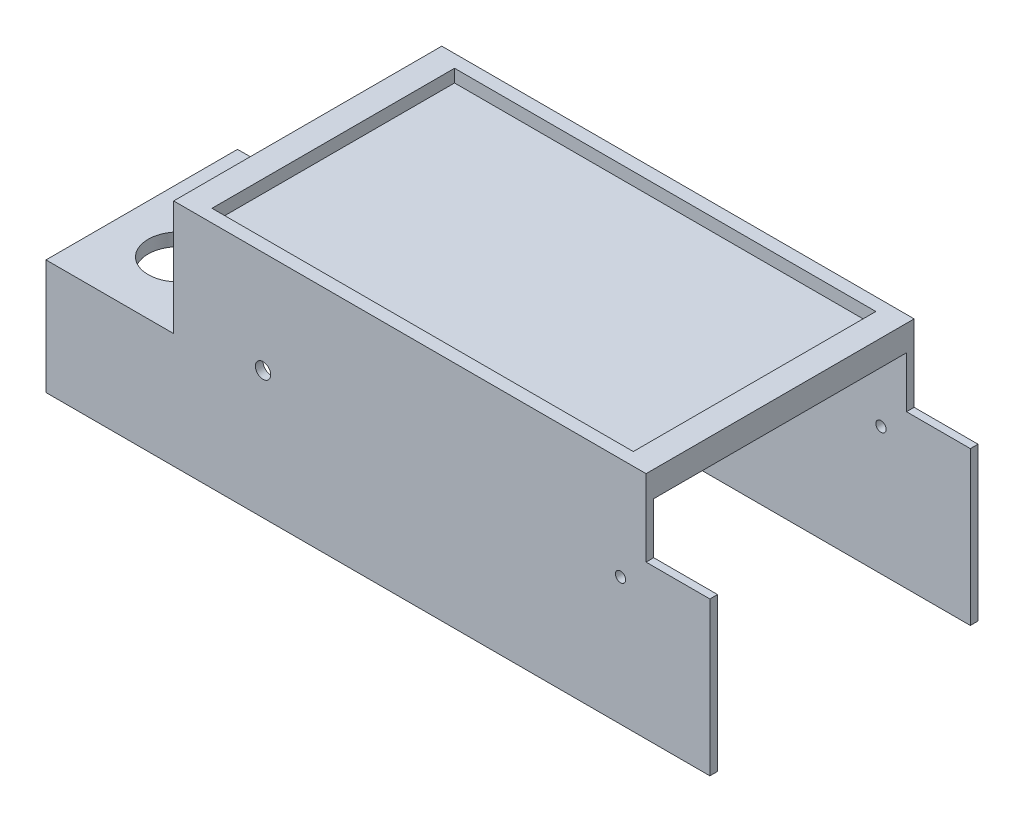
ISO-10303-21;
HEADER;
FILE_DESCRIPTION(('STEP AP214'),'2;1');
FILE_NAME('part.step','',(''),(''),'','','');
FILE_SCHEMA(('AUTOMOTIVE_DESIGN { 1 0 10303 214 1 1 1 1 }'));
ENDSEC;
DATA;
#1=APPLICATION_CONTEXT('core data for automotive mechanical design processes');
#2=APPLICATION_PROTOCOL_DEFINITION('international standard','automotive_design',2000,#1);
#3=PRODUCT_CONTEXT('',#1,'mechanical');
#4=PRODUCT('Part','Part','',(#3));
#5=PRODUCT_RELATED_PRODUCT_CATEGORY('part','',(#4));
#6=PRODUCT_DEFINITION_FORMATION('','',#4);
#7=PRODUCT_DEFINITION_CONTEXT('part definition',#1,'design');
#8=PRODUCT_DEFINITION('design','',#6,#7);
#9=PRODUCT_DEFINITION_SHAPE('','',#8);
#10=(LENGTH_UNIT() NAMED_UNIT(*) SI_UNIT(.MILLI.,.METRE.));
#11=(NAMED_UNIT(*) PLANE_ANGLE_UNIT() SI_UNIT($,.RADIAN.));
#12=(NAMED_UNIT(*) SI_UNIT($,.STERADIAN.) SOLID_ANGLE_UNIT());
#13=UNCERTAINTY_MEASURE_WITH_UNIT(LENGTH_MEASURE(1.E-05),#10,'distance_accuracy_value','');
#14=(GEOMETRIC_REPRESENTATION_CONTEXT(3) GLOBAL_UNCERTAINTY_ASSIGNED_CONTEXT((#13)) GLOBAL_UNIT_ASSIGNED_CONTEXT((#10,
#11,#12)) REPRESENTATION_CONTEXT('',''));
#15=CARTESIAN_POINT('',(0.,0.,0.));
#16=DIRECTION('',(0.,0.,1.));
#17=DIRECTION('',(1.,0.,0.));
#18=AXIS2_PLACEMENT_3D('',#15,#16,#17);
#19=CARTESIAN_POINT('',(105.,90.,-52.5));
#20=DIRECTION('',(-1.,0.,0.));
#21=DIRECTION('',(0.,0.,1.));
#22=AXIS2_PLACEMENT_3D('',#19,#20,#21);
#23=PLANE('',#22);
#24=DIRECTION('',(0.,-1.,0.));
#25=VECTOR('',#24,1.);
#26=CARTESIAN_POINT('',(105.,90.,-52.5));
#27=LINE('',#26,#25);
#28=CARTESIAN_POINT('',(105.,60.,-52.5));
#29=VERTEX_POINT('',#28);
#30=CARTESIAN_POINT('',(105.,0.,-52.5));
#31=VERTEX_POINT('',#30);
#32=EDGE_CURVE('E206',#29,#31,#27,.T.);
#33=ORIENTED_EDGE('',*,*,#32,.F.);
#34=DIRECTION('',(0.,0.,-1.));
#35=VECTOR('',#34,1.);
#36=CARTESIAN_POINT('',(105.,60.,-52.5));
#37=LINE('',#36,#35);
#38=CARTESIAN_POINT('',(105.,60.,-49.5));
#39=VERTEX_POINT('',#38);
#40=EDGE_CURVE('E190',#39,#29,#37,.T.);
#41=ORIENTED_EDGE('',*,*,#40,.F.);
#42=DIRECTION('',(0.,1.,0.));
#43=VECTOR('',#42,1.);
#44=CARTESIAN_POINT('',(105.,0.,-49.5));
#45=LINE('',#44,#43);
#46=CARTESIAN_POINT('',(105.,0.,-49.5));
#47=VERTEX_POINT('',#46);
#48=EDGE_CURVE('E300',#47,#39,#45,.T.);
#49=ORIENTED_EDGE('',*,*,#48,.F.);
#50=DIRECTION('',(0.,0.,-1.));
#51=VECTOR('',#50,1.);
#52=CARTESIAN_POINT('',(105.,0.,-52.5));
#53=LINE('',#52,#51);
#54=EDGE_CURVE('E212',#47,#31,#53,.T.);
#55=ORIENTED_EDGE('',*,*,#54,.T.);
#56=EDGE_LOOP('',(#33,#41,#49,#55));
#57=FACE_BOUND('',#56,.T.);
#58=ADVANCED_FACE('F42',(#57),#23,.F.);
#59=CARTESIAN_POINT('',(0.,0.,0.));
#60=DIRECTION('',(0.,1.,0.));
#61=DIRECTION('',(0.,0.,1.));
#62=AXIS2_PLACEMENT_3D('',#59,#60,#61);
#63=PLANE('',#62);
#64=DIRECTION('',(0.,0.,-1.));
#65=VECTOR('',#64,1.);
#66=CARTESIAN_POINT('',(-95.,0.,49.5));
#67=LINE('',#66,#65);
#68=CARTESIAN_POINT('',(-95.,0.,-19.5));
#69=VERTEX_POINT('',#68);
#70=CARTESIAN_POINT('',(-95.,0.,-49.5));
#71=VERTEX_POINT('',#70);
#72=EDGE_CURVE('E299',#69,#71,#67,.T.);
#73=ORIENTED_EDGE('',*,*,#72,.F.);
#74=DIRECTION('',(-1.,0.,0.));
#75=VECTOR('',#74,1.);
#76=CARTESIAN_POINT('',(105.,0.,-19.5));
#77=LINE('',#76,#75);
#78=CARTESIAN_POINT('',(-155.,0.,-19.5));
#79=VERTEX_POINT('',#78);
#80=EDGE_CURVE('E255',#69,#79,#77,.T.);
#81=ORIENTED_EDGE('',*,*,#80,.T.);
#82=DIRECTION('',(0.,0.,1.));
#83=VECTOR('',#82,1.);
#84=CARTESIAN_POINT('',(-155.,0.,52.5));
#85=LINE('',#84,#83);
#86=CARTESIAN_POINT('',(-155.,0.,-22.5));
#87=VERTEX_POINT('',#86);
#88=EDGE_CURVE('E279',#87,#79,#85,.T.);
#89=ORIENTED_EDGE('',*,*,#88,.F.);
#90=DIRECTION('',(1.,0.,0.));
#91=VECTOR('',#90,1.);
#92=CARTESIAN_POINT('',(-155.,0.,-22.5));
#93=LINE('',#92,#91);
#94=CARTESIAN_POINT('',(-105.,0.,-22.5));
#95=VERTEX_POINT('',#94);
#96=EDGE_CURVE('E282',#87,#95,#93,.T.);
#97=ORIENTED_EDGE('',*,*,#96,.T.);
#98=DIRECTION('',(0.,0.,1.));
#99=VECTOR('',#98,1.);
#100=CARTESIAN_POINT('',(-105.,0.,-52.5));
#101=LINE('',#100,#99);
#102=CARTESIAN_POINT('',(-105.,0.,-52.5));
#103=VERTEX_POINT('',#102);
#104=EDGE_CURVE('E365',#103,#95,#101,.T.);
#105=ORIENTED_EDGE('',*,*,#104,.F.);
#106=DIRECTION('',(-1.,0.,0.));
#107=VECTOR('',#106,1.);
#108=CARTESIAN_POINT('',(-105.,0.,-52.5));
#109=LINE('',#108,#107);
#110=EDGE_CURVE('E363',#31,#103,#109,.T.);
#111=ORIENTED_EDGE('',*,*,#110,.F.);
#112=ORIENTED_EDGE('',*,*,#54,.F.);
#113=DIRECTION('',(1.,0.,0.));
#114=VECTOR('',#113,1.);
#115=CARTESIAN_POINT('',(-95.,0.,-49.5));
#116=LINE('',#115,#114);
#117=EDGE_CURVE('E317',#71,#47,#116,.T.);
#118=ORIENTED_EDGE('',*,*,#117,.F.);
#119=EDGE_LOOP('',(#73,#81,#89,#97,#105,#111,#112,#118));
#120=FACE_BOUND('',#119,.T.);
#121=ADVANCED_FACE('F445',(#120),#63,.F.);
#122=CARTESIAN_POINT('',(-105.,90.,-52.5));
#123=DIRECTION('',(1.,0.,0.));
#124=DIRECTION('',(0.,0.,-1.));
#125=AXIS2_PLACEMENT_3D('',#122,#123,#124);
#126=PLANE('',#125);
#127=DIRECTION('',(0.,-1.,0.));
#128=VECTOR('',#127,1.);
#129=CARTESIAN_POINT('',(-105.,0.,-22.5));
#130=LINE('',#129,#128);
#131=CARTESIAN_POINT('',(-105.,45.,-22.5));
#132=VERTEX_POINT('',#131);
#133=EDGE_CURVE('E273',#132,#95,#130,.T.);
#134=ORIENTED_EDGE('',*,*,#133,.F.);
#135=DIRECTION('',(0.,0.,-1.));
#136=VECTOR('',#135,1.);
#137=CARTESIAN_POINT('',(-105.,45.,52.5));
#138=LINE('',#137,#136);
#139=CARTESIAN_POINT('',(-105.,45.,52.5));
#140=VERTEX_POINT('',#139);
#141=EDGE_CURVE('E268',#140,#132,#138,.T.);
#142=ORIENTED_EDGE('',*,*,#141,.F.);
#143=DIRECTION('',(0.,-1.,0.));
#144=VECTOR('',#143,1.);
#145=CARTESIAN_POINT('',(-105.,90.,52.5));
#146=LINE('',#145,#144);
#147=CARTESIAN_POINT('',(-105.,90.,52.5));
#148=VERTEX_POINT('',#147);
#149=EDGE_CURVE('E217',#148,#140,#146,.T.);
#150=ORIENTED_EDGE('',*,*,#149,.F.);
#151=DIRECTION('',(0.,0.,1.));
#152=VECTOR('',#151,1.);
#153=CARTESIAN_POINT('',(-105.,90.,-52.5));
#154=LINE('',#153,#152);
#155=CARTESIAN_POINT('',(-105.,90.,-52.5));
#156=VERTEX_POINT('',#155);
#157=EDGE_CURVE('E353',#156,#148,#154,.T.);
#158=ORIENTED_EDGE('',*,*,#157,.F.);
#159=DIRECTION('',(0.,-1.,0.));
#160=VECTOR('',#159,1.);
#161=CARTESIAN_POINT('',(-105.,90.,-52.5));
#162=LINE('',#161,#160);
#163=EDGE_CURVE('E214',#156,#103,#162,.T.);
#164=ORIENTED_EDGE('',*,*,#163,.T.);
#165=ORIENTED_EDGE('',*,*,#104,.T.);
#166=EDGE_LOOP('',(#134,#142,#150,#158,#164,#165));
#167=FACE_BOUND('',#166,.T.);
#168=ADVANCED_FACE('F449',(#167),#126,.F.);
#169=DIRECTION('',(0.,-1.,0.));
#170=VECTOR('',#169,1.);
#171=CARTESIAN_POINT('',(105.,0.,49.5));
#172=LINE('',#171,#170);
#173=CARTESIAN_POINT('',(105.,60.,49.5));
#174=VERTEX_POINT('',#173);
#175=CARTESIAN_POINT('',(105.,0.,49.5));
#176=VERTEX_POINT('',#175);
#177=EDGE_CURVE('E295',#174,#176,#172,.T.);
#178=ORIENTED_EDGE('',*,*,#177,.F.);
#179=CARTESIAN_POINT('',(105.,60.,52.5));
#180=VERTEX_POINT('',#179);
#181=EDGE_CURVE('E200',#180,#174,#37,.T.);
#182=ORIENTED_EDGE('',*,*,#181,.F.);
#183=DIRECTION('',(0.,-1.,0.));
#184=VECTOR('',#183,1.);
#185=CARTESIAN_POINT('',(105.,90.,52.5));
#186=LINE('',#185,#184);
#187=CARTESIAN_POINT('',(105.,0.,52.5));
#188=VERTEX_POINT('',#187);
#189=EDGE_CURVE('E359',#180,#188,#186,.T.);
#190=ORIENTED_EDGE('',*,*,#189,.T.);
#191=EDGE_CURVE('E360',#188,#176,#53,.T.);
#192=ORIENTED_EDGE('',*,*,#191,.T.);
#193=EDGE_LOOP('',(#178,#182,#190,#192));
#194=FACE_BOUND('',#193,.T.);
#195=ADVANCED_FACE('F44',(#194),#23,.F.);
#196=CARTESIAN_POINT('',(-105.,90.,-52.5));
#197=DIRECTION('',(0.,0.,1.));
#198=DIRECTION('',(1.,0.,0.));
#199=AXIS2_PLACEMENT_3D('',#196,#197,#198);
#200=PLANE('',#199);
#201=CARTESIAN_POINT('',(-70.,50.,-52.5));
#202=DIRECTION('',(0.,0.,1.));
#203=DIRECTION('',(1.,0.,0.));
#204=AXIS2_PLACEMENT_3D('',#201,#202,#203);
#205=CIRCLE('',#204,3.00000000000001);
#206=CARTESIAN_POINT('',(-67.,50.,-52.5));
#207=VERTEX_POINT('',#206);
#208=EDGE_CURVE('E230',#207,#207,#205,.T.);
#209=ORIENTED_EDGE('',*,*,#208,.T.);
#210=EDGE_LOOP('',(#209));
#211=FACE_BOUND('',#210,.T.);
#212=CARTESIAN_POINT('',(70.,50.,-52.5));
#213=DIRECTION('',(0.,0.,1.));
#214=DIRECTION('',(1.,0.,0.));
#215=AXIS2_PLACEMENT_3D('',#212,#213,#214);
#216=CIRCLE('',#215,2.);
#217=CARTESIAN_POINT('',(72.,50.,-52.5));
#218=VERTEX_POINT('',#217);
#219=EDGE_CURVE('E419',#218,#218,#216,.T.);
#220=ORIENTED_EDGE('',*,*,#219,.T.);
#221=EDGE_LOOP('',(#220));
#222=FACE_BOUND('',#221,.T.);
#223=DIRECTION('',(-1.,0.,0.));
#224=VECTOR('',#223,1.);
#225=CARTESIAN_POINT('',(-105.,90.,-52.5));
#226=LINE('',#225,#224);
#227=CARTESIAN_POINT('',(80.,90.,-52.5));
#228=VERTEX_POINT('',#227);
#229=EDGE_CURVE('E351',#228,#156,#226,.T.);
#230=ORIENTED_EDGE('',*,*,#229,.F.);
#231=DIRECTION('',(0.,1.,0.));
#232=VECTOR('',#231,1.);
#233=CARTESIAN_POINT('',(80.,60.,-52.5));
#234=LINE('',#233,#232);
#235=CARTESIAN_POINT('',(80.,60.,-52.5));
#236=VERTEX_POINT('',#235);
#237=EDGE_CURVE('E208',#236,#228,#234,.T.);
#238=ORIENTED_EDGE('',*,*,#237,.F.);
#239=DIRECTION('',(-1.,0.,0.));
#240=VECTOR('',#239,1.);
#241=CARTESIAN_POINT('',(105.,60.,-52.5));
#242=LINE('',#241,#240);
#243=EDGE_CURVE('E193',#29,#236,#242,.T.);
#244=ORIENTED_EDGE('',*,*,#243,.F.);
#245=ORIENTED_EDGE('',*,*,#32,.T.);
#246=ORIENTED_EDGE('',*,*,#110,.T.);
#247=ORIENTED_EDGE('',*,*,#163,.F.);
#248=EDGE_LOOP('',(#230,#238,#244,#245,#246,#247));
#249=FACE_BOUND('',#248,.T.);
#250=ADVANCED_FACE('F205',(#211,#222,#249),#200,.F.);
#251=CARTESIAN_POINT('',(-105.,90.,52.5));
#252=DIRECTION('',(0.,0.,-1.));
#253=DIRECTION('',(-1.,0.,0.));
#254=AXIS2_PLACEMENT_3D('',#251,#252,#253);
#255=PLANE('',#254);
#256=CARTESIAN_POINT('',(-70.,50.,52.5));
#257=DIRECTION('',(0.,0.,1.));
#258=DIRECTION('',(1.,0.,0.));
#259=AXIS2_PLACEMENT_3D('',#256,#257,#258);
#260=CIRCLE('',#259,3.00000000000001);
#261=CARTESIAN_POINT('',(-67.,50.,52.5));
#262=VERTEX_POINT('',#261);
#263=EDGE_CURVE('E416',#262,#262,#260,.T.);
#264=ORIENTED_EDGE('',*,*,#263,.F.);
#265=EDGE_LOOP('',(#264));
#266=FACE_BOUND('',#265,.T.);
#267=CARTESIAN_POINT('',(70.,50.,52.5));
#268=DIRECTION('',(0.,0.,1.));
#269=DIRECTION('',(1.,0.,0.));
#270=AXIS2_PLACEMENT_3D('',#267,#268,#269);
#271=CIRCLE('',#270,2.);
#272=CARTESIAN_POINT('',(72.,50.,52.5));
#273=VERTEX_POINT('',#272);
#274=EDGE_CURVE('E243',#273,#273,#271,.T.);
#275=ORIENTED_EDGE('',*,*,#274,.F.);
#276=EDGE_LOOP('',(#275));
#277=FACE_BOUND('',#276,.T.);
#278=DIRECTION('',(1.,0.,0.));
#279=VECTOR('',#278,1.);
#280=CARTESIAN_POINT('',(105.,60.,52.5));
#281=LINE('',#280,#279);
#282=CARTESIAN_POINT('',(80.,60.,52.5));
#283=VERTEX_POINT('',#282);
#284=EDGE_CURVE('E400',#283,#180,#281,.T.);
#285=ORIENTED_EDGE('',*,*,#284,.F.);
#286=DIRECTION('',(0.,1.,0.));
#287=VECTOR('',#286,1.);
#288=CARTESIAN_POINT('',(80.,60.,52.5));
#289=LINE('',#288,#287);
#290=CARTESIAN_POINT('',(80.,90.,52.5));
#291=VERTEX_POINT('',#290);
#292=EDGE_CURVE('E403',#283,#291,#289,.T.);
#293=ORIENTED_EDGE('',*,*,#292,.T.);
#294=DIRECTION('',(1.,0.,0.));
#295=VECTOR('',#294,1.);
#296=CARTESIAN_POINT('',(-105.,90.,52.5));
#297=LINE('',#296,#295);
#298=EDGE_CURVE('E356',#148,#291,#297,.T.);
#299=ORIENTED_EDGE('',*,*,#298,.F.);
#300=ORIENTED_EDGE('',*,*,#149,.T.);
#301=DIRECTION('',(1.,0.,0.));
#302=VECTOR('',#301,1.);
#303=CARTESIAN_POINT('',(-155.,45.,52.5));
#304=LINE('',#303,#302);
#305=CARTESIAN_POINT('',(-155.,45.,52.5));
#306=VERTEX_POINT('',#305);
#307=EDGE_CURVE('E292',#306,#140,#304,.T.);
#308=ORIENTED_EDGE('',*,*,#307,.F.);
#309=DIRECTION('',(0.,1.,0.));
#310=VECTOR('',#309,1.);
#311=CARTESIAN_POINT('',(-155.,0.,52.5));
#312=LINE('',#311,#310);
#313=CARTESIAN_POINT('',(-155.,0.,52.5));
#314=VERTEX_POINT('',#313);
#315=EDGE_CURVE('E269',#314,#306,#312,.T.);
#316=ORIENTED_EDGE('',*,*,#315,.F.);
#317=DIRECTION('',(1.,0.,0.));
#318=VECTOR('',#317,1.);
#319=CARTESIAN_POINT('',(-105.,0.,52.5));
#320=LINE('',#319,#318);
#321=EDGE_CURVE('E354',#314,#188,#320,.T.);
#322=ORIENTED_EDGE('',*,*,#321,.T.);
#323=ORIENTED_EDGE('',*,*,#189,.F.);
#324=EDGE_LOOP('',(#285,#293,#299,#300,#308,#316,#322,#323));
#325=FACE_BOUND('',#324,.T.);
#326=ADVANCED_FACE('F375',(#266,#277,#325),#255,.F.);
#327=CARTESIAN_POINT('',(0.,90.,0.));
#328=DIRECTION('',(0.,1.,0.));
#329=DIRECTION('',(0.,0.,1.));
#330=AXIS2_PLACEMENT_3D('',#327,#328,#329);
#331=PLANE('',#330);
#332=DIRECTION('',(0.,0.,1.));
#333=VECTOR('',#332,1.);
#334=CARTESIAN_POINT('',(80.,90.,-52.5));
#335=LINE('',#334,#333);
#336=EDGE_CURVE('E201',#228,#291,#335,.T.);
#337=ORIENTED_EDGE('',*,*,#336,.F.);
#338=ORIENTED_EDGE('',*,*,#229,.T.);
#339=ORIENTED_EDGE('',*,*,#157,.T.);
#340=ORIENTED_EDGE('',*,*,#298,.T.);
#341=EDGE_LOOP('',(#337,#338,#339,#340));
#342=FACE_BOUND('',#341,.T.);
#343=DIRECTION('',(0.,0.,1.));
#344=VECTOR('',#343,1.);
#345=CARTESIAN_POINT('',(-95.,90.,-47.5));
#346=LINE('',#345,#344);
#347=CARTESIAN_POINT('',(-95.,90.,-47.5));
#348=VERTEX_POINT('',#347);
#349=CARTESIAN_POINT('',(-95.,90.,47.5));
#350=VERTEX_POINT('',#349);
#351=EDGE_CURVE('E313',#348,#350,#346,.T.);
#352=ORIENTED_EDGE('',*,*,#351,.F.);
#353=DIRECTION('',(-1.,0.,0.));
#354=VECTOR('',#353,1.);
#355=CARTESIAN_POINT('',(-95.,90.,-47.5));
#356=LINE('',#355,#354);
#357=CARTESIAN_POINT('',(70.,90.,-47.5));
#358=VERTEX_POINT('',#357);
#359=EDGE_CURVE('E324',#358,#348,#356,.T.);
#360=ORIENTED_EDGE('',*,*,#359,.F.);
#361=DIRECTION('',(0.,0.,-1.));
#362=VECTOR('',#361,1.);
#363=CARTESIAN_POINT('',(70.,90.,-47.5));
#364=LINE('',#363,#362);
#365=CARTESIAN_POINT('',(70.,90.,47.5));
#366=VERTEX_POINT('',#365);
#367=EDGE_CURVE('E338',#366,#358,#364,.T.);
#368=ORIENTED_EDGE('',*,*,#367,.F.);
#369=DIRECTION('',(1.,0.,0.));
#370=VECTOR('',#369,1.);
#371=CARTESIAN_POINT('',(-95.,90.,47.5));
#372=LINE('',#371,#370);
#373=EDGE_CURVE('E335',#350,#366,#372,.T.);
#374=ORIENTED_EDGE('',*,*,#373,.F.);
#375=EDGE_LOOP('',(#352,#360,#368,#374));
#376=FACE_BOUND('',#375,.T.);
#377=ADVANCED_FACE('F431',(#342,#376),#331,.T.);
#378=CARTESIAN_POINT('',(-155.,0.,49.5));
#379=VERTEX_POINT('',#378);
#380=EDGE_CURVE('E278',#379,#314,#85,.T.);
#381=ORIENTED_EDGE('',*,*,#380,.F.);
#382=DIRECTION('',(1.,0.,0.));
#383=VECTOR('',#382,1.);
#384=CARTESIAN_POINT('',(-95.,0.,49.5));
#385=LINE('',#384,#383);
#386=EDGE_CURVE('E65',#379,#176,#385,.T.);
#387=ORIENTED_EDGE('',*,*,#386,.T.);
#388=ORIENTED_EDGE('',*,*,#191,.F.);
#389=ORIENTED_EDGE('',*,*,#321,.F.);
#390=EDGE_LOOP('',(#381,#387,#388,#389));
#391=FACE_BOUND('',#390,.T.);
#392=ADVANCED_FACE('F392',(#391),#63,.F.);
#393=CARTESIAN_POINT('',(-95.,85.,-47.5));
#394=DIRECTION('',(-1.,0.,0.));
#395=DIRECTION('',(0.,0.,1.));
#396=AXIS2_PLACEMENT_3D('',#393,#394,#395);
#397=PLANE('',#396);
#398=ORIENTED_EDGE('',*,*,#351,.T.);
#399=DIRECTION('',(0.,1.,0.));
#400=VECTOR('',#399,1.);
#401=CARTESIAN_POINT('',(-95.,85.,47.5));
#402=LINE('',#401,#400);
#403=CARTESIAN_POINT('',(-95.,85.,47.5));
#404=VERTEX_POINT('',#403);
#405=EDGE_CURVE('E333',#404,#350,#402,.T.);
#406=ORIENTED_EDGE('',*,*,#405,.F.);
#407=DIRECTION('',(0.,0.,1.));
#408=VECTOR('',#407,1.);
#409=CARTESIAN_POINT('',(-95.,85.,-47.5));
#410=LINE('',#409,#408);
#411=CARTESIAN_POINT('',(-95.,85.,-47.5));
#412=VERTEX_POINT('',#411);
#413=EDGE_CURVE('E320',#412,#404,#410,.T.);
#414=ORIENTED_EDGE('',*,*,#413,.F.);
#415=DIRECTION('',(0.,1.,0.));
#416=VECTOR('',#415,1.);
#417=CARTESIAN_POINT('',(-95.,85.,-47.5));
#418=LINE('',#417,#416);
#419=EDGE_CURVE('E343',#412,#348,#418,.T.);
#420=ORIENTED_EDGE('',*,*,#419,.T.);
#421=EDGE_LOOP('',(#398,#406,#414,#420));
#422=FACE_BOUND('',#421,.T.);
#423=ADVANCED_FACE('F493',(#422),#397,.F.);
#424=CARTESIAN_POINT('',(-95.,85.,-47.5));
#425=DIRECTION('',(0.,0.,-1.));
#426=DIRECTION('',(-1.,0.,0.));
#427=AXIS2_PLACEMENT_3D('',#424,#425,#426);
#428=PLANE('',#427);
#429=ORIENTED_EDGE('',*,*,#359,.T.);
#430=ORIENTED_EDGE('',*,*,#419,.F.);
#431=DIRECTION('',(-1.,0.,0.));
#432=VECTOR('',#431,1.);
#433=CARTESIAN_POINT('',(-95.,85.,-47.5));
#434=LINE('',#433,#432);
#435=CARTESIAN_POINT('',(70.,85.,-47.5));
#436=VERTEX_POINT('',#435);
#437=EDGE_CURVE('E330',#436,#412,#434,.T.);
#438=ORIENTED_EDGE('',*,*,#437,.F.);
#439=DIRECTION('',(0.,1.,0.));
#440=VECTOR('',#439,1.);
#441=CARTESIAN_POINT('',(70.,85.,-47.5));
#442=LINE('',#441,#440);
#443=EDGE_CURVE('E345',#436,#358,#442,.T.);
#444=ORIENTED_EDGE('',*,*,#443,.T.);
#445=EDGE_LOOP('',(#429,#430,#438,#444));
#446=FACE_BOUND('',#445,.T.);
#447=ADVANCED_FACE('F489',(#446),#428,.F.);
#448=CARTESIAN_POINT('',(70.,85.,-47.5));
#449=DIRECTION('',(1.,0.,0.));
#450=DIRECTION('',(0.,0.,-1.));
#451=AXIS2_PLACEMENT_3D('',#448,#449,#450);
#452=PLANE('',#451);
#453=ORIENTED_EDGE('',*,*,#367,.T.);
#454=ORIENTED_EDGE('',*,*,#443,.F.);
#455=DIRECTION('',(0.,0.,-1.));
#456=VECTOR('',#455,1.);
#457=CARTESIAN_POINT('',(70.,85.,-47.5));
#458=LINE('',#457,#456);
#459=CARTESIAN_POINT('',(70.,85.,47.5));
#460=VERTEX_POINT('',#459);
#461=EDGE_CURVE('E327',#460,#436,#458,.T.);
#462=ORIENTED_EDGE('',*,*,#461,.F.);
#463=DIRECTION('',(0.,1.,0.));
#464=VECTOR('',#463,1.);
#465=CARTESIAN_POINT('',(70.,85.,47.5));
#466=LINE('',#465,#464);
#467=EDGE_CURVE('E347',#460,#366,#466,.T.);
#468=ORIENTED_EDGE('',*,*,#467,.T.);
#469=EDGE_LOOP('',(#453,#454,#462,#468));
#470=FACE_BOUND('',#469,.T.);
#471=ADVANCED_FACE('F492',(#470),#452,.F.);
#472=CARTESIAN_POINT('',(-95.,85.,47.5));
#473=DIRECTION('',(0.,0.,1.));
#474=DIRECTION('',(1.,0.,0.));
#475=AXIS2_PLACEMENT_3D('',#472,#473,#474);
#476=PLANE('',#475);
#477=ORIENTED_EDGE('',*,*,#373,.T.);
#478=ORIENTED_EDGE('',*,*,#467,.F.);
#479=DIRECTION('',(1.,0.,0.));
#480=VECTOR('',#479,1.);
#481=CARTESIAN_POINT('',(-95.,85.,47.5));
#482=LINE('',#481,#480);
#483=EDGE_CURVE('E323',#404,#460,#482,.T.);
#484=ORIENTED_EDGE('',*,*,#483,.F.);
#485=ORIENTED_EDGE('',*,*,#405,.T.);
#486=EDGE_LOOP('',(#477,#478,#484,#485));
#487=FACE_BOUND('',#486,.T.);
#488=ADVANCED_FACE('F484',(#487),#476,.F.);
#489=CARTESIAN_POINT('',(0.,85.,0.));
#490=DIRECTION('',(0.,1.,0.));
#491=DIRECTION('',(0.,0.,1.));
#492=AXIS2_PLACEMENT_3D('',#489,#490,#491);
#493=PLANE('',#492);
#494=ORIENTED_EDGE('',*,*,#413,.T.);
#495=ORIENTED_EDGE('',*,*,#483,.T.);
#496=ORIENTED_EDGE('',*,*,#461,.T.);
#497=ORIENTED_EDGE('',*,*,#437,.T.);
#498=EDGE_LOOP('',(#494,#495,#496,#497));
#499=FACE_BOUND('',#498,.T.);
#500=ADVANCED_FACE('F474',(#499),#493,.T.);
#501=CARTESIAN_POINT('',(-95.,0.,49.5));
#502=DIRECTION('',(0.,0.,1.));
#503=DIRECTION('',(1.,0.,0.));
#504=AXIS2_PLACEMENT_3D('',#501,#502,#503);
#505=PLANE('',#504);
#506=CARTESIAN_POINT('',(-70.,50.,49.5));
#507=DIRECTION('',(0.,0.,1.));
#508=DIRECTION('',(1.,0.,0.));
#509=AXIS2_PLACEMENT_3D('',#506,#507,#508);
#510=CIRCLE('',#509,3.00000000000001);
#511=CARTESIAN_POINT('',(-67.,50.,49.5));
#512=VERTEX_POINT('',#511);
#513=EDGE_CURVE('E233',#512,#512,#510,.T.);
#514=ORIENTED_EDGE('',*,*,#513,.T.);
#515=EDGE_LOOP('',(#514));
#516=FACE_BOUND('',#515,.T.);
#517=CARTESIAN_POINT('',(70.,50.,49.5));
#518=DIRECTION('',(0.,0.,1.));
#519=DIRECTION('',(1.,0.,0.));
#520=AXIS2_PLACEMENT_3D('',#517,#518,#519);
#521=CIRCLE('',#520,2.);
#522=CARTESIAN_POINT('',(72.,50.,49.5));
#523=VERTEX_POINT('',#522);
#524=EDGE_CURVE('E229',#523,#523,#521,.T.);
#525=ORIENTED_EDGE('',*,*,#524,.T.);
#526=EDGE_LOOP('',(#525));
#527=FACE_BOUND('',#526,.T.);
#528=DIRECTION('',(1.,0.,0.));
#529=VECTOR('',#528,1.);
#530=CARTESIAN_POINT('',(-95.,80.,49.5));
#531=LINE('',#530,#529);
#532=CARTESIAN_POINT('',(-95.,80.,49.5));
#533=VERTEX_POINT('',#532);
#534=CARTESIAN_POINT('',(80.,80.,49.5));
#535=VERTEX_POINT('',#534);
#536=EDGE_CURVE('E310',#533,#535,#531,.T.);
#537=ORIENTED_EDGE('',*,*,#536,.T.);
#538=DIRECTION('',(0.,-1.,0.));
#539=VECTOR('',#538,1.);
#540=CARTESIAN_POINT('',(80.,0.,49.5));
#541=LINE('',#540,#539);
#542=CARTESIAN_POINT('',(80.,60.,49.5));
#543=VERTEX_POINT('',#542);
#544=EDGE_CURVE('E411',#535,#543,#541,.T.);
#545=ORIENTED_EDGE('',*,*,#544,.T.);
#546=DIRECTION('',(1.,0.,0.));
#547=VECTOR('',#546,1.);
#548=CARTESIAN_POINT('',(-95.,60.,49.5));
#549=LINE('',#548,#547);
#550=EDGE_CURVE('E405',#543,#174,#549,.T.);
#551=ORIENTED_EDGE('',*,*,#550,.T.);
#552=ORIENTED_EDGE('',*,*,#177,.T.);
#553=ORIENTED_EDGE('',*,*,#386,.F.);
#554=DIRECTION('',(0.,1.,0.));
#555=VECTOR('',#554,1.);
#556=CARTESIAN_POINT('',(-155.,40.,49.5));
#557=LINE('',#556,#555);
#558=CARTESIAN_POINT('',(-155.,40.,49.5));
#559=VERTEX_POINT('',#558);
#560=EDGE_CURVE('E250',#379,#559,#557,.T.);
#561=ORIENTED_EDGE('',*,*,#560,.T.);
#562=DIRECTION('',(-1.,0.,0.));
#563=VECTOR('',#562,1.);
#564=CARTESIAN_POINT('',(105.,40.,49.5));
#565=LINE('',#564,#563);
#566=CARTESIAN_POINT('',(-95.,40.,49.5));
#567=VERTEX_POINT('',#566);
#568=EDGE_CURVE('E259',#567,#559,#565,.T.);
#569=ORIENTED_EDGE('',*,*,#568,.F.);
#570=DIRECTION('',(0.,-1.,0.));
#571=VECTOR('',#570,1.);
#572=CARTESIAN_POINT('',(-95.,0.,49.5));
#573=LINE('',#572,#571);
#574=EDGE_CURVE('E296',#533,#567,#573,.T.);
#575=ORIENTED_EDGE('',*,*,#574,.F.);
#576=EDGE_LOOP('',(#537,#545,#551,#552,#553,#561,#569,#575));
#577=FACE_BOUND('',#576,.T.);
#578=ADVANCED_FACE('F471',(#516,#527,#577),#505,.F.);
#579=CARTESIAN_POINT('',(-95.,80.,49.5));
#580=DIRECTION('',(0.,1.,0.));
#581=DIRECTION('',(0.,0.,1.));
#582=AXIS2_PLACEMENT_3D('',#579,#580,#581);
#583=PLANE('',#582);
#584=DIRECTION('',(1.,0.,0.));
#585=VECTOR('',#584,1.);
#586=CARTESIAN_POINT('',(-95.,80.,-49.5));
#587=LINE('',#586,#585);
#588=CARTESIAN_POINT('',(-95.,80.,-49.5));
#589=VERTEX_POINT('',#588);
#590=CARTESIAN_POINT('',(80.,80.,-49.5));
#591=VERTEX_POINT('',#590);
#592=EDGE_CURVE('E314',#589,#591,#587,.T.);
#593=ORIENTED_EDGE('',*,*,#592,.T.);
#594=DIRECTION('',(0.,0.,1.));
#595=VECTOR('',#594,1.);
#596=CARTESIAN_POINT('',(80.,80.,49.5));
#597=LINE('',#596,#595);
#598=EDGE_CURVE('E408',#591,#535,#597,.T.);
#599=ORIENTED_EDGE('',*,*,#598,.T.);
#600=ORIENTED_EDGE('',*,*,#536,.F.);
#601=DIRECTION('',(0.,0.,1.));
#602=VECTOR('',#601,1.);
#603=CARTESIAN_POINT('',(-95.,80.,49.5));
#604=LINE('',#603,#602);
#605=EDGE_CURVE('E305',#589,#533,#604,.T.);
#606=ORIENTED_EDGE('',*,*,#605,.F.);
#607=EDGE_LOOP('',(#593,#599,#600,#606));
#608=FACE_BOUND('',#607,.T.);
#609=ADVANCED_FACE('F473',(#608),#583,.F.);
#610=CARTESIAN_POINT('',(-95.,0.,-49.5));
#611=DIRECTION('',(0.,0.,-1.));
#612=DIRECTION('',(-1.,0.,0.));
#613=AXIS2_PLACEMENT_3D('',#610,#611,#612);
#614=PLANE('',#613);
#615=CARTESIAN_POINT('',(-70.,50.,-49.5));
#616=DIRECTION('',(0.,0.,-1.));
#617=DIRECTION('',(-1.,0.,0.));
#618=AXIS2_PLACEMENT_3D('',#615,#616,#617);
#619=CIRCLE('',#618,3.00000000000001);
#620=CARTESIAN_POINT('',(-73.,50.,-49.5));
#621=VERTEX_POINT('',#620);
#622=EDGE_CURVE('E231',#621,#621,#619,.T.);
#623=ORIENTED_EDGE('',*,*,#622,.T.);
#624=EDGE_LOOP('',(#623));
#625=FACE_BOUND('',#624,.T.);
#626=CARTESIAN_POINT('',(70.,50.,-49.5));
#627=DIRECTION('',(0.,0.,-1.));
#628=DIRECTION('',(-1.,0.,0.));
#629=AXIS2_PLACEMENT_3D('',#626,#627,#628);
#630=CIRCLE('',#629,2.);
#631=CARTESIAN_POINT('',(68.,50.,-49.5));
#632=VERTEX_POINT('',#631);
#633=EDGE_CURVE('E226',#632,#632,#630,.T.);
#634=ORIENTED_EDGE('',*,*,#633,.T.);
#635=EDGE_LOOP('',(#634));
#636=FACE_BOUND('',#635,.T.);
#637=DIRECTION('',(-1.,0.,0.));
#638=VECTOR('',#637,1.);
#639=CARTESIAN_POINT('',(-95.,60.,-49.5));
#640=LINE('',#639,#638);
#641=CARTESIAN_POINT('',(80.,60.,-49.5));
#642=VERTEX_POINT('',#641);
#643=EDGE_CURVE('E50',#39,#642,#640,.T.);
#644=ORIENTED_EDGE('',*,*,#643,.T.);
#645=DIRECTION('',(0.,1.,0.));
#646=VECTOR('',#645,1.);
#647=CARTESIAN_POINT('',(80.,0.,-49.5));
#648=LINE('',#647,#646);
#649=EDGE_CURVE('E11',#642,#591,#648,.T.);
#650=ORIENTED_EDGE('',*,*,#649,.T.);
#651=ORIENTED_EDGE('',*,*,#592,.F.);
#652=DIRECTION('',(0.,1.,0.));
#653=VECTOR('',#652,1.);
#654=CARTESIAN_POINT('',(-95.,0.,-49.5));
#655=LINE('',#654,#653);
#656=EDGE_CURVE('E302',#71,#589,#655,.T.);
#657=ORIENTED_EDGE('',*,*,#656,.F.);
#658=ORIENTED_EDGE('',*,*,#117,.T.);
#659=ORIENTED_EDGE('',*,*,#48,.T.);
#660=EDGE_LOOP('',(#644,#650,#651,#657,#658,#659));
#661=FACE_BOUND('',#660,.T.);
#662=ADVANCED_FACE('F481',(#625,#636,#661),#614,.F.);
#663=CARTESIAN_POINT('',(-95.,0.,0.));
#664=DIRECTION('',(-1.,0.,0.));
#665=DIRECTION('',(0.,0.,1.));
#666=AXIS2_PLACEMENT_3D('',#663,#664,#665);
#667=PLANE('',#666);
#668=DIRECTION('',(0.,0.,-1.));
#669=VECTOR('',#668,1.);
#670=CARTESIAN_POINT('',(-95.,40.,0.));
#671=LINE('',#670,#669);
#672=CARTESIAN_POINT('',(-95.,40.,-19.5));
#673=VERTEX_POINT('',#672);
#674=EDGE_CURVE('E258',#567,#673,#671,.T.);
#675=ORIENTED_EDGE('',*,*,#674,.T.);
#676=DIRECTION('',(0.,-1.,0.));
#677=VECTOR('',#676,1.);
#678=CARTESIAN_POINT('',(-95.,0.,-19.5));
#679=LINE('',#678,#677);
#680=EDGE_CURVE('E265',#673,#69,#679,.T.);
#681=ORIENTED_EDGE('',*,*,#680,.T.);
#682=ORIENTED_EDGE('',*,*,#72,.T.);
#683=ORIENTED_EDGE('',*,*,#656,.T.);
#684=ORIENTED_EDGE('',*,*,#605,.T.);
#685=ORIENTED_EDGE('',*,*,#574,.T.);
#686=EDGE_LOOP('',(#675,#681,#682,#683,#684,#685));
#687=FACE_BOUND('',#686,.T.);
#688=ADVANCED_FACE('F536',(#687),#667,.F.);
#689=CARTESIAN_POINT('',(-155.,45.,52.5));
#690=DIRECTION('',(0.,-1.,0.));
#691=DIRECTION('',(0.,0.,-1.));
#692=AXIS2_PLACEMENT_3D('',#689,#690,#691);
#693=PLANE('',#692);
#694=CARTESIAN_POINT('',(-130.,45.,25.5));
#695=DIRECTION('',(0.,1.,0.));
#696=DIRECTION('',(0.,0.,1.));
#697=AXIS2_PLACEMENT_3D('',#694,#695,#696);
#698=CIRCLE('',#697,12.);
#699=CARTESIAN_POINT('',(-130.,45.,37.5));
#700=VERTEX_POINT('',#699);
#701=EDGE_CURVE('E225',#700,#700,#698,.T.);
#702=ORIENTED_EDGE('',*,*,#701,.F.);
#703=EDGE_LOOP('',(#702));
#704=FACE_BOUND('',#703,.T.);
#705=ORIENTED_EDGE('',*,*,#141,.T.);
#706=DIRECTION('',(1.,0.,0.));
#707=VECTOR('',#706,1.);
#708=CARTESIAN_POINT('',(-155.,45.,-22.5));
#709=LINE('',#708,#707);
#710=CARTESIAN_POINT('',(-155.,45.,-22.5));
#711=VERTEX_POINT('',#710);
#712=EDGE_CURVE('E289',#711,#132,#709,.T.);
#713=ORIENTED_EDGE('',*,*,#712,.F.);
#714=DIRECTION('',(0.,0.,-1.));
#715=VECTOR('',#714,1.);
#716=CARTESIAN_POINT('',(-155.,45.,52.5));
#717=LINE('',#716,#715);
#718=EDGE_CURVE('E272',#306,#711,#717,.T.);
#719=ORIENTED_EDGE('',*,*,#718,.F.);
#720=ORIENTED_EDGE('',*,*,#307,.T.);
#721=EDGE_LOOP('',(#705,#713,#719,#720));
#722=FACE_BOUND('',#721,.T.);
#723=ADVANCED_FACE('F381',(#704,#722),#693,.F.);
#724=CARTESIAN_POINT('',(-155.,0.,-22.5));
#725=DIRECTION('',(0.,0.,1.));
#726=DIRECTION('',(1.,0.,0.));
#727=AXIS2_PLACEMENT_3D('',#724,#725,#726);
#728=PLANE('',#727);
#729=ORIENTED_EDGE('',*,*,#133,.T.);
#730=ORIENTED_EDGE('',*,*,#96,.F.);
#731=DIRECTION('',(0.,-1.,0.));
#732=VECTOR('',#731,1.);
#733=CARTESIAN_POINT('',(-155.,0.,-22.5));
#734=LINE('',#733,#732);
#735=EDGE_CURVE('E276',#711,#87,#734,.T.);
#736=ORIENTED_EDGE('',*,*,#735,.F.);
#737=ORIENTED_EDGE('',*,*,#712,.T.);
#738=EDGE_LOOP('',(#729,#730,#736,#737));
#739=FACE_BOUND('',#738,.T.);
#740=ADVANCED_FACE('F460',(#739),#728,.F.);
#741=CARTESIAN_POINT('',(-155.,0.,0.));
#742=DIRECTION('',(-1.,0.,0.));
#743=DIRECTION('',(0.,0.,1.));
#744=AXIS2_PLACEMENT_3D('',#741,#742,#743);
#745=PLANE('',#744);
#746=DIRECTION('',(0.,-1.,0.));
#747=VECTOR('',#746,1.);
#748=CARTESIAN_POINT('',(-155.,40.,-19.5));
#749=LINE('',#748,#747);
#750=CARTESIAN_POINT('',(-155.,40.,-19.5));
#751=VERTEX_POINT('',#750);
#752=EDGE_CURVE('E224',#751,#79,#749,.T.);
#753=ORIENTED_EDGE('',*,*,#752,.F.);
#754=DIRECTION('',(0.,0.,-1.));
#755=VECTOR('',#754,1.);
#756=CARTESIAN_POINT('',(-155.,40.,-19.5));
#757=LINE('',#756,#755);
#758=EDGE_CURVE('E252',#559,#751,#757,.T.);
#759=ORIENTED_EDGE('',*,*,#758,.F.);
#760=ORIENTED_EDGE('',*,*,#560,.F.);
#761=ORIENTED_EDGE('',*,*,#380,.T.);
#762=ORIENTED_EDGE('',*,*,#315,.T.);
#763=ORIENTED_EDGE('',*,*,#718,.T.);
#764=ORIENTED_EDGE('',*,*,#735,.T.);
#765=ORIENTED_EDGE('',*,*,#88,.T.);
#766=EDGE_LOOP('',(#753,#759,#760,#761,#762,#763,#764,#765));
#767=FACE_BOUND('',#766,.T.);
#768=ADVANCED_FACE('F386',(#767),#745,.T.);
#769=CARTESIAN_POINT('',(105.,40.,-19.5));
#770=DIRECTION('',(0.,0.,-1.));
#771=DIRECTION('',(0.,1.,0.));
#772=AXIS2_PLACEMENT_3D('',#769,#770,#771);
#773=PLANE('',#772);
#774=DIRECTION('',(-1.,0.,0.));
#775=VECTOR('',#774,1.);
#776=CARTESIAN_POINT('',(105.,40.,-19.5));
#777=LINE('',#776,#775);
#778=EDGE_CURVE('E256',#673,#751,#777,.T.);
#779=ORIENTED_EDGE('',*,*,#778,.T.);
#780=ORIENTED_EDGE('',*,*,#752,.T.);
#781=ORIENTED_EDGE('',*,*,#80,.F.);
#782=ORIENTED_EDGE('',*,*,#680,.F.);
#783=EDGE_LOOP('',(#779,#780,#781,#782));
#784=FACE_BOUND('',#783,.T.);
#785=ADVANCED_FACE('F465',(#784),#773,.F.);
#786=CARTESIAN_POINT('',(105.,40.,-19.5));
#787=DIRECTION('',(0.,1.,0.));
#788=DIRECTION('',(0.,0.,1.));
#789=AXIS2_PLACEMENT_3D('',#786,#787,#788);
#790=PLANE('',#789);
#791=CARTESIAN_POINT('',(-130.,40.,25.5));
#792=DIRECTION('',(0.,1.,0.));
#793=DIRECTION('',(0.,0.,1.));
#794=AXIS2_PLACEMENT_3D('',#791,#792,#793);
#795=CIRCLE('',#794,12.);
#796=CARTESIAN_POINT('',(-130.,40.,37.5));
#797=VERTEX_POINT('',#796);
#798=EDGE_CURVE('E221',#797,#797,#795,.T.);
#799=ORIENTED_EDGE('',*,*,#798,.T.);
#800=EDGE_LOOP('',(#799));
#801=FACE_BOUND('',#800,.T.);
#802=ORIENTED_EDGE('',*,*,#568,.T.);
#803=ORIENTED_EDGE('',*,*,#758,.T.);
#804=ORIENTED_EDGE('',*,*,#778,.F.);
#805=ORIENTED_EDGE('',*,*,#674,.F.);
#806=EDGE_LOOP('',(#802,#803,#804,#805));
#807=FACE_BOUND('',#806,.T.);
#808=ADVANCED_FACE('F468',(#801,#807),#790,.F.);
#809=CARTESIAN_POINT('',(-130.,0.,25.5));
#810=DIRECTION('',(0.,1.,0.));
#811=DIRECTION('',(0.,0.,1.));
#812=AXIS2_PLACEMENT_3D('',#809,#810,#811);
#813=CYLINDRICAL_SURFACE('',#812,12.);
#814=CARTESIAN_POINT('',(-130.,45.,37.5));
#815=CARTESIAN_POINT('',(-130.,44.9479166666667,37.5));
#816=CARTESIAN_POINT('',(-130.,44.8958333333333,37.5));
#817=CARTESIAN_POINT('',(-130.,44.7916666666667,37.5));
#818=CARTESIAN_POINT('',(-130.,44.7395833333333,37.5));
#819=CARTESIAN_POINT('',(-130.,44.6354166666667,37.5));
#820=CARTESIAN_POINT('',(-130.,44.5833333333333,37.5));
#821=CARTESIAN_POINT('',(-130.,44.4791666666667,37.5));
#822=CARTESIAN_POINT('',(-130.,44.4270833333333,37.5));
#823=CARTESIAN_POINT('',(-130.,44.3229166666667,37.5));
#824=CARTESIAN_POINT('',(-130.,44.2708333333333,37.5));
#825=CARTESIAN_POINT('',(-130.,44.1666666666667,37.5));
#826=CARTESIAN_POINT('',(-130.,44.1145833333333,37.5));
#827=CARTESIAN_POINT('',(-130.,44.0104166666667,37.5));
#828=CARTESIAN_POINT('',(-130.,43.9583333333333,37.5));
#829=CARTESIAN_POINT('',(-130.,43.8541666666667,37.5));
#830=CARTESIAN_POINT('',(-130.,43.8020833333333,37.5));
#831=CARTESIAN_POINT('',(-130.,43.6979166666667,37.5));
#832=CARTESIAN_POINT('',(-130.,43.6458333333333,37.5));
#833=CARTESIAN_POINT('',(-130.,43.5416666666667,37.5));
#834=CARTESIAN_POINT('',(-130.,43.4895833333333,37.5));
#835=CARTESIAN_POINT('',(-130.,43.3854166666667,37.5));
#836=CARTESIAN_POINT('',(-130.,43.3333333333333,37.5));
#837=CARTESIAN_POINT('',(-130.,43.2291666666667,37.5));
#838=CARTESIAN_POINT('',(-130.,43.1770833333333,37.5));
#839=CARTESIAN_POINT('',(-130.,43.0729166666667,37.5));
#840=CARTESIAN_POINT('',(-130.,43.0208333333333,37.5));
#841=CARTESIAN_POINT('',(-130.,42.9166666666667,37.5));
#842=CARTESIAN_POINT('',(-130.,42.8645833333333,37.5));
#843=CARTESIAN_POINT('',(-130.,42.7604166666667,37.5));
#844=CARTESIAN_POINT('',(-130.,42.7083333333333,37.5));
#845=CARTESIAN_POINT('',(-130.,42.6041666666667,37.5));
#846=CARTESIAN_POINT('',(-130.,42.5520833333333,37.5));
#847=CARTESIAN_POINT('',(-130.,42.4479166666667,37.5));
#848=CARTESIAN_POINT('',(-130.,42.3958333333333,37.5));
#849=CARTESIAN_POINT('',(-130.,42.2916666666667,37.5));
#850=CARTESIAN_POINT('',(-130.,42.2395833333333,37.5));
#851=CARTESIAN_POINT('',(-130.,42.1354166666667,37.5));
#852=CARTESIAN_POINT('',(-130.,42.0833333333333,37.5));
#853=CARTESIAN_POINT('',(-130.,41.9791666666667,37.5));
#854=CARTESIAN_POINT('',(-130.,41.9270833333333,37.5));
#855=CARTESIAN_POINT('',(-130.,41.8229166666667,37.5));
#856=CARTESIAN_POINT('',(-130.,41.7708333333333,37.5));
#857=CARTESIAN_POINT('',(-130.,41.6666666666667,37.5));
#858=CARTESIAN_POINT('',(-130.,41.6145833333333,37.5));
#859=CARTESIAN_POINT('',(-130.,41.5104166666667,37.5));
#860=CARTESIAN_POINT('',(-130.,41.4583333333333,37.5));
#861=CARTESIAN_POINT('',(-130.,41.3541666666667,37.5));
#862=CARTESIAN_POINT('',(-130.,41.3020833333333,37.5));
#863=CARTESIAN_POINT('',(-130.,41.1979166666667,37.5));
#864=CARTESIAN_POINT('',(-130.,41.1458333333333,37.5));
#865=CARTESIAN_POINT('',(-130.,41.0416666666667,37.5));
#866=CARTESIAN_POINT('',(-130.,40.9895833333333,37.5));
#867=CARTESIAN_POINT('',(-130.,40.8854166666667,37.5));
#868=CARTESIAN_POINT('',(-130.,40.8333333333333,37.5));
#869=CARTESIAN_POINT('',(-130.,40.7291666666667,37.5));
#870=CARTESIAN_POINT('',(-130.,40.6770833333333,37.5));
#871=CARTESIAN_POINT('',(-130.,40.5729166666667,37.5));
#872=CARTESIAN_POINT('',(-130.,40.5208333333333,37.5));
#873=CARTESIAN_POINT('',(-130.,40.4166666666667,37.5));
#874=CARTESIAN_POINT('',(-130.,40.3645833333333,37.5));
#875=CARTESIAN_POINT('',(-130.,40.2604166666667,37.5));
#876=CARTESIAN_POINT('',(-130.,40.2083333333333,37.5));
#877=CARTESIAN_POINT('',(-130.,40.1041666666667,37.5));
#878=CARTESIAN_POINT('',(-130.,40.0520833333333,37.5));
#879=CARTESIAN_POINT('',(-130.,40.,37.5));
#880=B_SPLINE_CURVE_WITH_KNOTS('',3,(#814,#815,#816,#817,#818,#819,#820,#821,#822,#823,#824,
#825,#826,#827,#828,#829,#830,#831,#832,#833,#834,#835,#836,#837,#838,#839,#840,#841,#842,#843,
#844,#845,#846,#847,#848,#849,#850,#851,#852,#853,#854,#855,#856,#857,#858,#859,#860,#861,#862,
#863,#864,#865,#866,#867,#868,#869,#870,#871,#872,#873,#874,#875,#876,#877,#878,#879),
.UNSPECIFIED.,.F.,.F.,(4,2,2,2,2,2,2,2,2,2,2,2,2,2,2,2,2,2,2,2,2,2,2,2,2,2,2,2,2,2,2,2,4),(0.,
0.156249999999997,0.3125,0.468750000000004,0.625000000000001,0.781249999999997,
0.937500000000001,1.09375,1.25,1.40625,1.5625,1.71875,1.875,2.03125,2.1875,2.34375000000001,2.5,
2.65625,2.8125,2.96875000000001,3.125,3.28125,3.4375,3.59375000000001,3.75,3.90625,4.0625,
4.21875000000001,4.375,4.53125,4.6875,4.84375000000001,5.),.UNSPECIFIED.);
#881=EDGE_CURVE('BSEAM567',#700,#797,#880,.T.);
#882=ORIENTED_EDGE('',*,*,#701,.T.);
#883=ORIENTED_EDGE('',*,*,#798,.F.);
#884=ORIENTED_EDGE('',*,*,#881,.T.);
#885=ORIENTED_EDGE('',*,*,#881,.F.);
#886=EDGE_LOOP('',(#882,#884,#883,#885));
#887=FACE_BOUND('',#886,.T.);
#888=ADVANCED_FACE('F567',(#887),#813,.F.);
#889=CARTESIAN_POINT('',(70.,50.,-52.5));
#890=DIRECTION('',(0.,0.,1.));
#891=DIRECTION('',(1.,0.,0.));
#892=AXIS2_PLACEMENT_3D('',#889,#890,#891);
#893=CYLINDRICAL_SURFACE('',#892,2.);
#894=ORIENTED_EDGE('',*,*,#219,.F.);
#895=EDGE_LOOP('',(#894));
#896=FACE_BOUND('',#895,.T.);
#897=ORIENTED_EDGE('',*,*,#633,.F.);
#898=EDGE_LOOP('',(#897));
#899=FACE_BOUND('',#898,.T.);
#900=ADVANCED_FACE('F575',(#896,#899),#893,.F.);
#901=CARTESIAN_POINT('',(-70.,50.,-52.5));
#902=DIRECTION('',(0.,0.,1.));
#903=DIRECTION('',(1.,0.,0.));
#904=AXIS2_PLACEMENT_3D('',#901,#902,#903);
#905=CYLINDRICAL_SURFACE('',#904,3.00000000000001);
#906=ORIENTED_EDGE('',*,*,#208,.F.);
#907=EDGE_LOOP('',(#906));
#908=FACE_BOUND('',#907,.T.);
#909=ORIENTED_EDGE('',*,*,#622,.F.);
#910=EDGE_LOOP('',(#909));
#911=FACE_BOUND('',#910,.T.);
#912=ADVANCED_FACE('F583',(#908,#911),#905,.F.);
#913=ORIENTED_EDGE('',*,*,#274,.T.);
#914=EDGE_LOOP('',(#913));
#915=FACE_BOUND('',#914,.T.);
#916=ORIENTED_EDGE('',*,*,#524,.F.);
#917=EDGE_LOOP('',(#916));
#918=FACE_BOUND('',#917,.T.);
#919=ADVANCED_FACE('F427',(#915,#918),#893,.F.);
#920=ORIENTED_EDGE('',*,*,#263,.T.);
#921=EDGE_LOOP('',(#920));
#922=FACE_BOUND('',#921,.T.);
#923=ORIENTED_EDGE('',*,*,#513,.F.);
#924=EDGE_LOOP('',(#923));
#925=FACE_BOUND('',#924,.T.);
#926=ADVANCED_FACE('F593',(#922,#925),#905,.F.);
#927=CARTESIAN_POINT('',(80.,60.,-52.5));
#928=DIRECTION('',(-1.,0.,0.));
#929=DIRECTION('',(0.,0.,1.));
#930=AXIS2_PLACEMENT_3D('',#927,#928,#929);
#931=PLANE('',#930);
#932=ORIENTED_EDGE('',*,*,#598,.F.);
#933=ORIENTED_EDGE('',*,*,#649,.F.);
#934=DIRECTION('',(0.,0.,1.));
#935=VECTOR('',#934,1.);
#936=CARTESIAN_POINT('',(80.,60.,-52.5));
#937=LINE('',#936,#935);
#938=EDGE_CURVE('E57',#236,#642,#937,.T.);
#939=ORIENTED_EDGE('',*,*,#938,.F.);
#940=ORIENTED_EDGE('',*,*,#237,.T.);
#941=ORIENTED_EDGE('',*,*,#336,.T.);
#942=ORIENTED_EDGE('',*,*,#292,.F.);
#943=EDGE_CURVE('E209',#543,#283,#937,.T.);
#944=ORIENTED_EDGE('',*,*,#943,.F.);
#945=ORIENTED_EDGE('',*,*,#544,.F.);
#946=EDGE_LOOP('',(#932,#933,#939,#940,#941,#942,#944,#945));
#947=FACE_BOUND('',#946,.T.);
#948=ADVANCED_FACE('F604',(#947),#931,.F.);
#949=CARTESIAN_POINT('',(0.,60.,0.));
#950=DIRECTION('',(0.,-1.,0.));
#951=DIRECTION('',(0.,0.,-1.));
#952=AXIS2_PLACEMENT_3D('',#949,#950,#951);
#953=PLANE('',#952);
#954=ORIENTED_EDGE('',*,*,#943,.T.);
#955=ORIENTED_EDGE('',*,*,#284,.T.);
#956=ORIENTED_EDGE('',*,*,#181,.T.);
#957=ORIENTED_EDGE('',*,*,#550,.F.);
#958=EDGE_LOOP('',(#954,#955,#956,#957));
#959=FACE_BOUND('',#958,.T.);
#960=ADVANCED_FACE('F611',(#959),#953,.F.);
#961=ORIENTED_EDGE('',*,*,#40,.T.);
#962=ORIENTED_EDGE('',*,*,#243,.T.);
#963=ORIENTED_EDGE('',*,*,#938,.T.);
#964=ORIENTED_EDGE('',*,*,#643,.F.);
#965=EDGE_LOOP('',(#961,#962,#963,#964));
#966=FACE_BOUND('',#965,.T.);
#967=ADVANCED_FACE('F192',(#966),#953,.F.);
#968=CLOSED_SHELL('',(#58,#121,#168,#195,#250,#326,#377,#392,#423,#447,#471,#488,#500,#578,#609,
#662,#688,#723,#740,#768,#785,#808,#888,#900,#912,#919,#926,#948,#960,#967));
#969=MANIFOLD_SOLID_BREP('B2',#968);
#970=ADVANCED_BREP_SHAPE_REPRESENTATION('',(#18,#969),#14);
#971=SHAPE_DEFINITION_REPRESENTATION(#9,#970);
ENDSEC;
END-ISO-10303-21;
